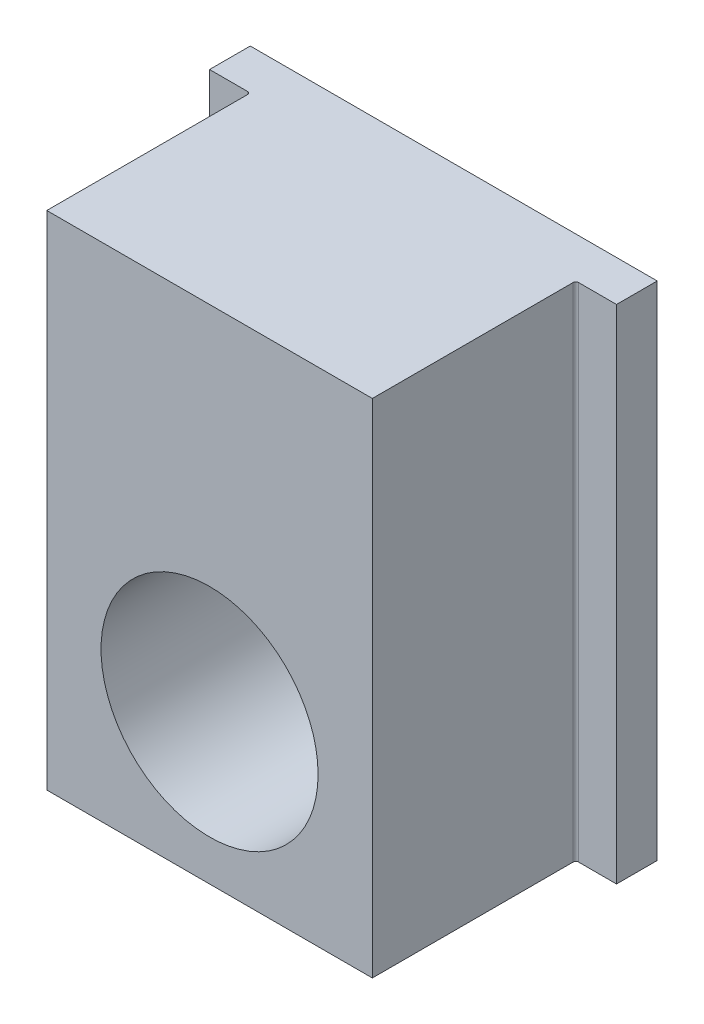
ISO-10303-21;
HEADER;
FILE_DESCRIPTION(('STEP AP214'),'2;1');
FILE_NAME('part.step','',(''),(''),'','','');
FILE_SCHEMA(('AUTOMOTIVE_DESIGN { 1 0 10303 214 1 1 1 1 }'));
ENDSEC;
DATA;
#1=APPLICATION_CONTEXT('core data for automotive mechanical design processes');
#2=APPLICATION_PROTOCOL_DEFINITION('international standard','automotive_design',2000,#1);
#3=PRODUCT_CONTEXT('',#1,'mechanical');
#4=PRODUCT('Part','Part','',(#3));
#5=PRODUCT_RELATED_PRODUCT_CATEGORY('part','',(#4));
#6=PRODUCT_DEFINITION_FORMATION('','',#4);
#7=PRODUCT_DEFINITION_CONTEXT('part definition',#1,'design');
#8=PRODUCT_DEFINITION('design','',#6,#7);
#9=PRODUCT_DEFINITION_SHAPE('','',#8);
#10=(LENGTH_UNIT() NAMED_UNIT(*) SI_UNIT(.MILLI.,.METRE.));
#11=(NAMED_UNIT(*) PLANE_ANGLE_UNIT() SI_UNIT($,.RADIAN.));
#12=(NAMED_UNIT(*) SI_UNIT($,.STERADIAN.) SOLID_ANGLE_UNIT());
#13=UNCERTAINTY_MEASURE_WITH_UNIT(LENGTH_MEASURE(1.E-05),#10,'distance_accuracy_value','');
#14=(GEOMETRIC_REPRESENTATION_CONTEXT(3) GLOBAL_UNCERTAINTY_ASSIGNED_CONTEXT((#13)) GLOBAL_UNIT_ASSIGNED_CONTEXT((#10,
#11,#12)) REPRESENTATION_CONTEXT('',''));
#15=CARTESIAN_POINT('',(0.,0.,0.));
#16=DIRECTION('',(0.,0.,1.));
#17=DIRECTION('',(1.,0.,0.));
#18=AXIS2_PLACEMENT_3D('',#15,#16,#17);
#19=CARTESIAN_POINT('',(12.,37.,2.99999999999999));
#20=DIRECTION('',(1.,0.,0.));
#21=DIRECTION('',(0.,0.,-1.));
#22=AXIS2_PLACEMENT_3D('',#19,#20,#21);
#23=PLANE('',#22);
#24=DIRECTION('',(0.,0.,1.));
#25=VECTOR('',#24,1.);
#26=CARTESIAN_POINT('',(12.,0.,2.99999999999999));
#27=LINE('',#26,#25);
#28=CARTESIAN_POINT('',(12.,0.,3.19999999999999));
#29=VERTEX_POINT('',#28);
#30=CARTESIAN_POINT('',(12.,0.,18.));
#31=VERTEX_POINT('',#30);
#32=EDGE_CURVE('E148',#29,#31,#27,.T.);
#33=ORIENTED_EDGE('',*,*,#32,.F.);
#34=DIRECTION('',(0.,-1.,0.));
#35=VECTOR('',#34,1.);
#36=CARTESIAN_POINT('',(12.,37.,3.19999999999999));
#37=LINE('',#36,#35);
#38=CARTESIAN_POINT('',(12.,37.,3.19999999999999));
#39=VERTEX_POINT('',#38);
#40=EDGE_CURVE('E51',#29,#39,#37,.F.);
#41=ORIENTED_EDGE('',*,*,#40,.T.);
#42=DIRECTION('',(0.,0.,1.));
#43=VECTOR('',#42,1.);
#44=CARTESIAN_POINT('',(12.,37.,2.99999999999999));
#45=LINE('',#44,#43);
#46=CARTESIAN_POINT('',(12.,37.,18.));
#47=VERTEX_POINT('',#46);
#48=EDGE_CURVE('E109',#39,#47,#45,.T.);
#49=ORIENTED_EDGE('',*,*,#48,.T.);
#50=DIRECTION('',(0.,-1.,0.));
#51=VECTOR('',#50,1.);
#52=CARTESIAN_POINT('',(12.,37.,18.));
#53=LINE('',#52,#51);
#54=EDGE_CURVE('E111',#47,#31,#53,.T.);
#55=ORIENTED_EDGE('',*,*,#54,.T.);
#56=EDGE_LOOP('',(#33,#41,#49,#55));
#57=FACE_BOUND('',#56,.T.);
#58=ADVANCED_FACE('F36',(#57),#23,.T.);
#59=CARTESIAN_POINT('',(15.,37.,2.99999999999999));
#60=DIRECTION('',(0.,0.,1.));
#61=DIRECTION('',(1.,0.,0.));
#62=AXIS2_PLACEMENT_3D('',#59,#60,#61);
#63=PLANE('',#62);
#64=DIRECTION('',(-1.,0.,0.));
#65=VECTOR('',#64,1.);
#66=CARTESIAN_POINT('',(15.,37.,2.99999999999999));
#67=LINE('',#66,#65);
#68=CARTESIAN_POINT('',(15.,37.,2.99999999999999));
#69=VERTEX_POINT('',#68);
#70=CARTESIAN_POINT('',(12.2,37.,2.99999999999999));
#71=VERTEX_POINT('',#70);
#72=EDGE_CURVE('E125',#69,#71,#67,.T.);
#73=ORIENTED_EDGE('',*,*,#72,.T.);
#74=DIRECTION('',(0.,-1.,0.));
#75=VECTOR('',#74,1.);
#76=CARTESIAN_POINT('',(12.2,0.,2.99999999999999));
#77=LINE('',#76,#75);
#78=CARTESIAN_POINT('',(12.2,0.,2.99999999999999));
#79=VERTEX_POINT('',#78);
#80=EDGE_CURVE('E182',#71,#79,#77,.T.);
#81=ORIENTED_EDGE('',*,*,#80,.T.);
#82=DIRECTION('',(-1.,0.,0.));
#83=VECTOR('',#82,1.);
#84=CARTESIAN_POINT('',(15.,0.,2.99999999999999));
#85=LINE('',#84,#83);
#86=CARTESIAN_POINT('',(15.,0.,2.99999999999999));
#87=VERTEX_POINT('',#86);
#88=EDGE_CURVE('E117',#87,#79,#85,.T.);
#89=ORIENTED_EDGE('',*,*,#88,.F.);
#90=DIRECTION('',(0.,-1.,0.));
#91=VECTOR('',#90,1.);
#92=CARTESIAN_POINT('',(15.,37.,2.99999999999999));
#93=LINE('',#92,#91);
#94=EDGE_CURVE('E167',#69,#87,#93,.T.);
#95=ORIENTED_EDGE('',*,*,#94,.F.);
#96=EDGE_LOOP('',(#73,#81,#89,#95));
#97=FACE_BOUND('',#96,.T.);
#98=ADVANCED_FACE('F218',(#97),#63,.T.);
#99=CARTESIAN_POINT('',(15.,37.,0.));
#100=DIRECTION('',(1.,0.,0.));
#101=DIRECTION('',(0.,0.,-1.));
#102=AXIS2_PLACEMENT_3D('',#99,#100,#101);
#103=PLANE('',#102);
#104=DIRECTION('',(0.,0.,1.));
#105=VECTOR('',#104,1.);
#106=CARTESIAN_POINT('',(15.,0.,0.));
#107=LINE('',#106,#105);
#108=CARTESIAN_POINT('',(15.,0.,0.));
#109=VERTEX_POINT('',#108);
#110=EDGE_CURVE('E163',#109,#87,#107,.T.);
#111=ORIENTED_EDGE('',*,*,#110,.F.);
#112=DIRECTION('',(0.,-1.,0.));
#113=VECTOR('',#112,1.);
#114=CARTESIAN_POINT('',(15.,37.,0.));
#115=LINE('',#114,#113);
#116=CARTESIAN_POINT('',(15.,37.,0.));
#117=VERTEX_POINT('',#116);
#118=EDGE_CURVE('E170',#117,#109,#115,.T.);
#119=ORIENTED_EDGE('',*,*,#118,.F.);
#120=DIRECTION('',(0.,0.,1.));
#121=VECTOR('',#120,1.);
#122=CARTESIAN_POINT('',(15.,37.,0.));
#123=LINE('',#122,#121);
#124=EDGE_CURVE('E143',#117,#69,#123,.T.);
#125=ORIENTED_EDGE('',*,*,#124,.T.);
#126=ORIENTED_EDGE('',*,*,#94,.T.);
#127=EDGE_LOOP('',(#111,#119,#125,#126));
#128=FACE_BOUND('',#127,.T.);
#129=ADVANCED_FACE('F215',(#128),#103,.T.);
#130=CARTESIAN_POINT('',(-15.,37.,0.));
#131=DIRECTION('',(0.,0.,-1.));
#132=DIRECTION('',(-1.,0.,0.));
#133=AXIS2_PLACEMENT_3D('',#130,#131,#132);
#134=PLANE('',#133);
#135=CARTESIAN_POINT('',(0.,11.,0.));
#136=DIRECTION('',(0.,0.,1.));
#137=DIRECTION('',(1.,0.,0.));
#138=AXIS2_PLACEMENT_3D('',#135,#136,#137);
#139=CIRCLE('',#138,8.);
#140=CARTESIAN_POINT('',(8.,11.,0.));
#141=VERTEX_POINT('',#140);
#142=EDGE_CURVE('E150',#141,#141,#139,.T.);
#143=ORIENTED_EDGE('',*,*,#142,.T.);
#144=EDGE_LOOP('',(#143));
#145=FACE_BOUND('',#144,.T.);
#146=DIRECTION('',(1.,0.,0.));
#147=VECTOR('',#146,1.);
#148=CARTESIAN_POINT('',(-15.,0.,0.));
#149=LINE('',#148,#147);
#150=CARTESIAN_POINT('',(-15.,0.,0.));
#151=VERTEX_POINT('',#150);
#152=EDGE_CURVE('E160',#151,#109,#149,.T.);
#153=ORIENTED_EDGE('',*,*,#152,.F.);
#154=DIRECTION('',(0.,-1.,0.));
#155=VECTOR('',#154,1.);
#156=CARTESIAN_POINT('',(-15.,37.,0.));
#157=LINE('',#156,#155);
#158=CARTESIAN_POINT('',(-15.,37.,0.));
#159=VERTEX_POINT('',#158);
#160=EDGE_CURVE('E172',#159,#151,#157,.T.);
#161=ORIENTED_EDGE('',*,*,#160,.F.);
#162=DIRECTION('',(1.,0.,0.));
#163=VECTOR('',#162,1.);
#164=CARTESIAN_POINT('',(-15.,37.,0.));
#165=LINE('',#164,#163);
#166=EDGE_CURVE('E140',#159,#117,#165,.T.);
#167=ORIENTED_EDGE('',*,*,#166,.T.);
#168=ORIENTED_EDGE('',*,*,#118,.T.);
#169=EDGE_LOOP('',(#153,#161,#167,#168));
#170=FACE_BOUND('',#169,.T.);
#171=ADVANCED_FACE('F211',(#145,#170),#134,.T.);
#172=CARTESIAN_POINT('',(-15.,37.,3.));
#173=DIRECTION('',(-1.,0.,0.));
#174=DIRECTION('',(0.,0.,1.));
#175=AXIS2_PLACEMENT_3D('',#172,#173,#174);
#176=PLANE('',#175);
#177=DIRECTION('',(0.,0.,-1.));
#178=VECTOR('',#177,1.);
#179=CARTESIAN_POINT('',(-15.,0.,3.));
#180=LINE('',#179,#178);
#181=CARTESIAN_POINT('',(-15.,0.,3.));
#182=VERTEX_POINT('',#181);
#183=EDGE_CURVE('E157',#182,#151,#180,.T.);
#184=ORIENTED_EDGE('',*,*,#183,.F.);
#185=DIRECTION('',(0.,-1.,0.));
#186=VECTOR('',#185,1.);
#187=CARTESIAN_POINT('',(-15.,37.,3.));
#188=LINE('',#187,#186);
#189=CARTESIAN_POINT('',(-15.,37.,3.));
#190=VERTEX_POINT('',#189);
#191=EDGE_CURVE('E174',#190,#182,#188,.T.);
#192=ORIENTED_EDGE('',*,*,#191,.F.);
#193=DIRECTION('',(0.,0.,-1.));
#194=VECTOR('',#193,1.);
#195=CARTESIAN_POINT('',(-15.,37.,3.));
#196=LINE('',#195,#194);
#197=EDGE_CURVE('E137',#190,#159,#196,.T.);
#198=ORIENTED_EDGE('',*,*,#197,.T.);
#199=ORIENTED_EDGE('',*,*,#160,.T.);
#200=EDGE_LOOP('',(#184,#192,#198,#199));
#201=FACE_BOUND('',#200,.T.);
#202=ADVANCED_FACE('F206',(#201),#176,.T.);
#203=CARTESIAN_POINT('',(-12.,37.,2.99999999999999));
#204=DIRECTION('',(0.,0.,1.));
#205=DIRECTION('',(1.,0.,0.));
#206=AXIS2_PLACEMENT_3D('',#203,#204,#205);
#207=PLANE('',#206);
#208=DIRECTION('',(-1.,0.,0.));
#209=VECTOR('',#208,1.);
#210=CARTESIAN_POINT('',(-12.,0.,2.99999999999999));
#211=LINE('',#210,#209);
#212=CARTESIAN_POINT('',(-12.2,0.,2.99999999999999));
#213=VERTEX_POINT('',#212);
#214=EDGE_CURVE('E155',#213,#182,#211,.T.);
#215=ORIENTED_EDGE('',*,*,#214,.F.);
#216=DIRECTION('',(0.,-1.,0.));
#217=VECTOR('',#216,1.);
#218=CARTESIAN_POINT('',(-12.2,37.,2.99999999999999));
#219=LINE('',#218,#217);
#220=CARTESIAN_POINT('',(-12.2,37.,2.99999999999999));
#221=VERTEX_POINT('',#220);
#222=EDGE_CURVE('E180',#213,#221,#219,.F.);
#223=ORIENTED_EDGE('',*,*,#222,.T.);
#224=DIRECTION('',(-1.,0.,0.));
#225=VECTOR('',#224,1.);
#226=CARTESIAN_POINT('',(-12.,37.,2.99999999999999));
#227=LINE('',#226,#225);
#228=EDGE_CURVE('E132',#221,#190,#227,.T.);
#229=ORIENTED_EDGE('',*,*,#228,.T.);
#230=ORIENTED_EDGE('',*,*,#191,.T.);
#231=EDGE_LOOP('',(#215,#223,#229,#230));
#232=FACE_BOUND('',#231,.T.);
#233=ADVANCED_FACE('F202',(#232),#207,.T.);
#234=CARTESIAN_POINT('',(-12.,37.,18.));
#235=DIRECTION('',(-1.,0.,0.));
#236=DIRECTION('',(0.,0.,1.));
#237=AXIS2_PLACEMENT_3D('',#234,#235,#236);
#238=PLANE('',#237);
#239=DIRECTION('',(0.,0.,-1.));
#240=VECTOR('',#239,1.);
#241=CARTESIAN_POINT('',(-12.,37.,18.));
#242=LINE('',#241,#240);
#243=CARTESIAN_POINT('',(-12.,37.,18.));
#244=VERTEX_POINT('',#243);
#245=CARTESIAN_POINT('',(-12.,37.,3.19999999999999));
#246=VERTEX_POINT('',#245);
#247=EDGE_CURVE('E130',#244,#246,#242,.T.);
#248=ORIENTED_EDGE('',*,*,#247,.T.);
#249=DIRECTION('',(0.,-1.,0.));
#250=VECTOR('',#249,1.);
#251=CARTESIAN_POINT('',(-12.,0.,3.19999999999999));
#252=LINE('',#251,#250);
#253=CARTESIAN_POINT('',(-12.,0.,3.19999999999999));
#254=VERTEX_POINT('',#253);
#255=EDGE_CURVE('E169',#246,#254,#252,.T.);
#256=ORIENTED_EDGE('',*,*,#255,.T.);
#257=DIRECTION('',(0.,0.,-1.));
#258=VECTOR('',#257,1.);
#259=CARTESIAN_POINT('',(-12.,0.,18.));
#260=LINE('',#259,#258);
#261=CARTESIAN_POINT('',(-12.,0.,18.));
#262=VERTEX_POINT('',#261);
#263=EDGE_CURVE('E152',#262,#254,#260,.T.);
#264=ORIENTED_EDGE('',*,*,#263,.F.);
#265=DIRECTION('',(0.,-1.,0.));
#266=VECTOR('',#265,1.);
#267=CARTESIAN_POINT('',(-12.,37.,18.));
#268=LINE('',#267,#266);
#269=EDGE_CURVE('E124',#244,#262,#268,.T.);
#270=ORIENTED_EDGE('',*,*,#269,.F.);
#271=EDGE_LOOP('',(#248,#256,#264,#270));
#272=FACE_BOUND('',#271,.T.);
#273=ADVANCED_FACE('F196',(#272),#238,.T.);
#274=CARTESIAN_POINT('',(12.,37.,18.));
#275=DIRECTION('',(0.,0.,1.));
#276=DIRECTION('',(1.,0.,0.));
#277=AXIS2_PLACEMENT_3D('',#274,#275,#276);
#278=PLANE('',#277);
#279=CARTESIAN_POINT('',(0.,11.,18.));
#280=DIRECTION('',(0.,0.,1.));
#281=DIRECTION('',(1.,0.,0.));
#282=AXIS2_PLACEMENT_3D('',#279,#280,#281);
#283=CIRCLE('',#282,8.);
#284=CARTESIAN_POINT('',(8.,11.,18.));
#285=VERTEX_POINT('',#284);
#286=EDGE_CURVE('E260',#285,#285,#283,.T.);
#287=ORIENTED_EDGE('',*,*,#286,.F.);
#288=EDGE_LOOP('',(#287));
#289=FACE_BOUND('',#288,.T.);
#290=DIRECTION('',(-1.,0.,0.));
#291=VECTOR('',#290,1.);
#292=CARTESIAN_POINT('',(12.,0.,18.));
#293=LINE('',#292,#291);
#294=EDGE_CURVE('E123',#31,#262,#293,.T.);
#295=ORIENTED_EDGE('',*,*,#294,.F.);
#296=ORIENTED_EDGE('',*,*,#54,.F.);
#297=DIRECTION('',(-1.,0.,0.));
#298=VECTOR('',#297,1.);
#299=CARTESIAN_POINT('',(12.,37.,18.));
#300=LINE('',#299,#298);
#301=EDGE_CURVE('E116',#47,#244,#300,.T.);
#302=ORIENTED_EDGE('',*,*,#301,.T.);
#303=ORIENTED_EDGE('',*,*,#269,.T.);
#304=EDGE_LOOP('',(#295,#296,#302,#303));
#305=FACE_BOUND('',#304,.T.);
#306=ADVANCED_FACE('F121',(#289,#305),#278,.T.);
#307=CARTESIAN_POINT('',(0.,37.,0.));
#308=DIRECTION('',(0.,-1.,0.));
#309=DIRECTION('',(0.,0.,-1.));
#310=AXIS2_PLACEMENT_3D('',#307,#308,#309);
#311=PLANE('',#310);
#312=ORIENTED_EDGE('',*,*,#48,.F.);
#313=CARTESIAN_POINT('',(12.2,37.,3.19999999999999));
#314=DIRECTION('',(0.,-1.,0.));
#315=DIRECTION('',(0.,0.,-1.));
#316=AXIS2_PLACEMENT_3D('',#313,#314,#315);
#317=CIRCLE('',#316,0.2);
#318=EDGE_CURVE('E11',#39,#71,#317,.T.);
#319=ORIENTED_EDGE('',*,*,#318,.T.);
#320=ORIENTED_EDGE('',*,*,#72,.F.);
#321=ORIENTED_EDGE('',*,*,#124,.F.);
#322=ORIENTED_EDGE('',*,*,#166,.F.);
#323=ORIENTED_EDGE('',*,*,#197,.F.);
#324=ORIENTED_EDGE('',*,*,#228,.F.);
#325=CARTESIAN_POINT('',(-12.2,37.,3.19999999999999));
#326=DIRECTION('',(0.,-1.,0.));
#327=DIRECTION('',(0.,0.,-1.));
#328=AXIS2_PLACEMENT_3D('',#325,#326,#327);
#329=CIRCLE('',#328,0.2);
#330=EDGE_CURVE('E188',#221,#246,#329,.T.);
#331=ORIENTED_EDGE('',*,*,#330,.T.);
#332=ORIENTED_EDGE('',*,*,#247,.F.);
#333=ORIENTED_EDGE('',*,*,#301,.F.);
#334=EDGE_LOOP('',(#312,#319,#320,#321,#322,#323,#324,#331,#332,#333));
#335=FACE_BOUND('',#334,.T.);
#336=ADVANCED_FACE('F128',(#335),#311,.F.);
#337=CARTESIAN_POINT('',(0.,0.,0.));
#338=DIRECTION('',(0.,-1.,0.));
#339=DIRECTION('',(0.,0.,-1.));
#340=AXIS2_PLACEMENT_3D('',#337,#338,#339);
#341=PLANE('',#340);
#342=ORIENTED_EDGE('',*,*,#88,.T.);
#343=CARTESIAN_POINT('',(12.2,0.,3.19999999999999));
#344=DIRECTION('',(0.,-1.,0.));
#345=DIRECTION('',(0.,0.,-1.));
#346=AXIS2_PLACEMENT_3D('',#343,#344,#345);
#347=CIRCLE('',#346,0.2);
#348=EDGE_CURVE('E44',#79,#29,#347,.F.);
#349=ORIENTED_EDGE('',*,*,#348,.T.);
#350=ORIENTED_EDGE('',*,*,#32,.T.);
#351=ORIENTED_EDGE('',*,*,#294,.T.);
#352=ORIENTED_EDGE('',*,*,#263,.T.);
#353=CARTESIAN_POINT('',(-12.2,0.,3.19999999999999));
#354=DIRECTION('',(0.,-1.,0.));
#355=DIRECTION('',(0.,0.,-1.));
#356=AXIS2_PLACEMENT_3D('',#353,#354,#355);
#357=CIRCLE('',#356,0.2);
#358=EDGE_CURVE('E186',#254,#213,#357,.F.);
#359=ORIENTED_EDGE('',*,*,#358,.T.);
#360=ORIENTED_EDGE('',*,*,#214,.T.);
#361=ORIENTED_EDGE('',*,*,#183,.T.);
#362=ORIENTED_EDGE('',*,*,#152,.T.);
#363=ORIENTED_EDGE('',*,*,#110,.T.);
#364=EDGE_LOOP('',(#342,#349,#350,#351,#352,#359,#360,#361,#362,#363));
#365=FACE_BOUND('',#364,.T.);
#366=ADVANCED_FACE('F200',(#365),#341,.T.);
#367=CARTESIAN_POINT('',(0.,11.,0.));
#368=DIRECTION('',(0.,0.,1.));
#369=DIRECTION('',(1.,0.,0.));
#370=AXIS2_PLACEMENT_3D('',#367,#368,#369);
#371=CYLINDRICAL_SURFACE('',#370,8.);
#372=ORIENTED_EDGE('',*,*,#142,.F.);
#373=EDGE_LOOP('',(#372));
#374=FACE_BOUND('',#373,.T.);
#375=ORIENTED_EDGE('',*,*,#286,.T.);
#376=EDGE_LOOP('',(#375));
#377=FACE_BOUND('',#376,.T.);
#378=ADVANCED_FACE('F225',(#374,#377),#371,.F.);
#379=CARTESIAN_POINT('',(-12.2,37.,3.19999999999999));
#380=DIRECTION('',(0.,1.,0.));
#381=DIRECTION('',(0.,0.,1.));
#382=AXIS2_PLACEMENT_3D('',#379,#380,#381);
#383=CYLINDRICAL_SURFACE('',#382,0.2);
#384=ORIENTED_EDGE('',*,*,#330,.F.);
#385=ORIENTED_EDGE('',*,*,#222,.F.);
#386=ORIENTED_EDGE('',*,*,#358,.F.);
#387=ORIENTED_EDGE('',*,*,#255,.F.);
#388=EDGE_LOOP('',(#384,#385,#386,#387));
#389=FACE_BOUND('',#388,.T.);
#390=ADVANCED_FACE('F198',(#389),#383,.F.);
#391=CARTESIAN_POINT('',(12.2,37.,3.19999999999999));
#392=DIRECTION('',(0.,1.,0.));
#393=DIRECTION('',(0.,0.,1.));
#394=AXIS2_PLACEMENT_3D('',#391,#392,#393);
#395=CYLINDRICAL_SURFACE('',#394,0.2);
#396=ORIENTED_EDGE('',*,*,#318,.F.);
#397=ORIENTED_EDGE('',*,*,#40,.F.);
#398=ORIENTED_EDGE('',*,*,#348,.F.);
#399=ORIENTED_EDGE('',*,*,#80,.F.);
#400=EDGE_LOOP('',(#396,#397,#398,#399));
#401=FACE_BOUND('',#400,.T.);
#402=ADVANCED_FACE('F38',(#401),#395,.F.);
#403=CLOSED_SHELL('',(#58,#98,#129,#171,#202,#233,#273,#306,#336,#366,#378,#390,#402));
#404=MANIFOLD_SOLID_BREP('B2',#403);
#405=ADVANCED_BREP_SHAPE_REPRESENTATION('',(#18,#404),#14);
#406=SHAPE_DEFINITION_REPRESENTATION(#9,#405);
ENDSEC;
END-ISO-10303-21;
